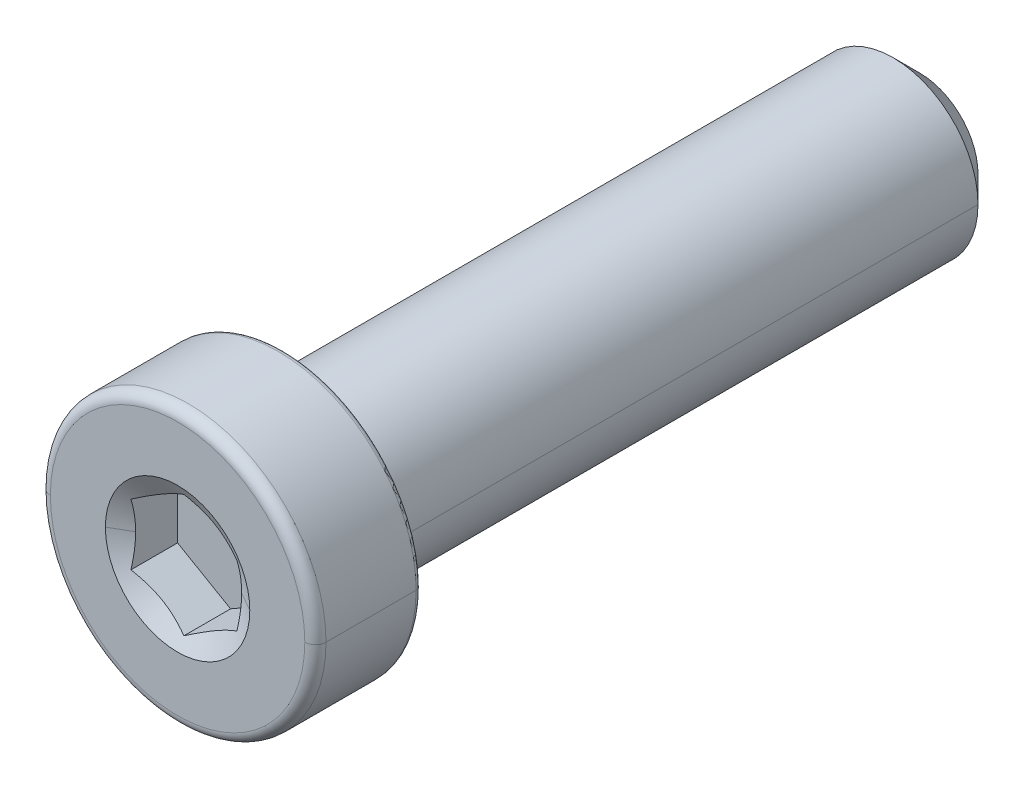
ISO-10303-21;
HEADER;
FILE_DESCRIPTION(('STEP AP214'),'2;1');
FILE_NAME('part.step','',(''),(''),'','','');
FILE_SCHEMA(('AUTOMOTIVE_DESIGN { 1 0 10303 214 1 1 1 1 }'));
ENDSEC;
DATA;
#1=APPLICATION_CONTEXT('core data for automotive mechanical design processes');
#2=APPLICATION_PROTOCOL_DEFINITION('international standard','automotive_design',2000,#1);
#3=PRODUCT_CONTEXT('',#1,'mechanical');
#4=PRODUCT('Part','Part','',(#3));
#5=PRODUCT_RELATED_PRODUCT_CATEGORY('part','',(#4));
#6=PRODUCT_DEFINITION_FORMATION('','',#4);
#7=PRODUCT_DEFINITION_CONTEXT('part definition',#1,'design');
#8=PRODUCT_DEFINITION('design','',#6,#7);
#9=PRODUCT_DEFINITION_SHAPE('','',#8);
#10=(LENGTH_UNIT() NAMED_UNIT(*) SI_UNIT(.MILLI.,.METRE.));
#11=(NAMED_UNIT(*) PLANE_ANGLE_UNIT() SI_UNIT($,.RADIAN.));
#12=(NAMED_UNIT(*) SI_UNIT($,.STERADIAN.) SOLID_ANGLE_UNIT());
#13=UNCERTAINTY_MEASURE_WITH_UNIT(LENGTH_MEASURE(1.E-05),#10,'distance_accuracy_value','');
#14=(GEOMETRIC_REPRESENTATION_CONTEXT(3) GLOBAL_UNCERTAINTY_ASSIGNED_CONTEXT((#13)) GLOBAL_UNIT_ASSIGNED_CONTEXT((#10,
#11,#12)) REPRESENTATION_CONTEXT('',''));
#15=CARTESIAN_POINT('',(0.,0.,0.));
#16=DIRECTION('',(0.,0.,1.));
#17=DIRECTION('',(1.,0.,0.));
#18=AXIS2_PLACEMENT_3D('',#15,#16,#17);
#19=CARTESIAN_POINT('',(0.,2.88675134594812,15.));
#20=DIRECTION('',(-0.5,0.866025403784439,0.));
#21=DIRECTION('',(0.,0.,1.));
#22=AXIS2_PLACEMENT_3D('',#19,#20,#21);
#23=PLANE('',#22);
#24=DIRECTION('',(0.,0.,1.));
#25=VECTOR('',#24,1.);
#26=CARTESIAN_POINT('',(0.,2.88675134594812,15.));
#27=LINE('',#26,#25);
#28=CARTESIAN_POINT('',(0.,2.88675134594812,15.));
#29=VERTEX_POINT('',#28);
#30=CARTESIAN_POINT('',(0.,2.88675134594812,17.2004275085882));
#31=VERTEX_POINT('',#30);
#32=EDGE_CURVE('E11',#29,#31,#27,.T.);
#33=ORIENTED_EDGE('',*,*,#32,.T.);
#34=CARTESIAN_POINT('',(0.,2.88675134594812,17.2004275085881));
#35=CARTESIAN_POINT('',(-0.668337161458471,2.50088670587065,16.9776484547663));
#36=CARTESIAN_POINT('',(-1.24761370688667,2.16644123643244,16.9771373916047));
#37=CARTESIAN_POINT('',(-1.55740642704751,1.98758232605459,16.9768640788869));
#38=CARTESIAN_POINT('',(-1.88103545904448,1.80073501731356,17.0371948002052));
#39=CARTESIAN_POINT('',(-2.17432824927882,1.63140234592039,17.0918702583466));
#40=CARTESIAN_POINT('',(-2.5,1.44337567297406,17.2004275085881));
#41=B_SPLINE_CURVE_WITH_KNOTS('',2,(#34,#35,#36,#37,#38,#39,#40),.UNSPECIFIED.,.F.,.F.,(3,2,2,
3),(0.,0.5,0.75,1.),.UNSPECIFIED.);
#42=CARTESIAN_POINT('',(-2.5,1.44337567297406,17.2004275085882));
#43=VERTEX_POINT('',#42);
#44=EDGE_CURVE('E180',#31,#43,#41,.T.);
#45=ORIENTED_EDGE('',*,*,#44,.T.);
#46=DIRECTION('',(0.,0.,1.));
#47=VECTOR('',#46,1.);
#48=CARTESIAN_POINT('',(-2.5,1.44337567297406,15.));
#49=LINE('',#48,#47);
#50=CARTESIAN_POINT('',(-2.5,1.44337567297406,15.));
#51=VERTEX_POINT('',#50);
#52=EDGE_CURVE('E174',#51,#43,#49,.T.);
#53=ORIENTED_EDGE('',*,*,#52,.F.);
#54=DIRECTION('',(-0.866025403784439,-0.5,0.));
#55=VECTOR('',#54,1.);
#56=CARTESIAN_POINT('',(0.,2.88675134594812,15.));
#57=LINE('',#56,#55);
#58=EDGE_CURVE('E386',#29,#51,#57,.T.);
#59=ORIENTED_EDGE('',*,*,#58,.F.);
#60=EDGE_LOOP('',(#33,#45,#53,#59));
#61=FACE_BOUND('',#60,.T.);
#62=ADVANCED_FACE('F16',(#61),#23,.F.);
#63=CARTESIAN_POINT('',(2.5,1.44337567297406,15.));
#64=DIRECTION('',(0.5,0.866025403784439,0.));
#65=DIRECTION('',(0.,0.,-1.));
#66=AXIS2_PLACEMENT_3D('',#63,#64,#65);
#67=PLANE('',#66);
#68=DIRECTION('',(0.,0.,1.));
#69=VECTOR('',#68,1.);
#70=CARTESIAN_POINT('',(2.5,1.44337567297406,15.));
#71=LINE('',#70,#69);
#72=CARTESIAN_POINT('',(2.5,1.44337567297406,15.));
#73=VERTEX_POINT('',#72);
#74=CARTESIAN_POINT('',(2.5,1.44337567297406,17.2004275085882));
#75=VERTEX_POINT('',#74);
#76=EDGE_CURVE('E28',#73,#75,#71,.T.);
#77=ORIENTED_EDGE('',*,*,#76,.T.);
#78=CARTESIAN_POINT('',(2.5,1.44337567297406,17.2004275085881));
#79=CARTESIAN_POINT('',(1.83166283856774,1.8292403130364,16.977648454775));
#80=CARTESIAN_POINT('',(1.25238629311333,2.16368578248975,16.9771373916047));
#81=CARTESIAN_POINT('',(0.942593572977376,2.34254469285323,16.9768640788823));
#82=CARTESIAN_POINT('',(0.618964540955522,2.52939200160862,17.0371948002052));
#83=CARTESIAN_POINT('',(0.3256717507212,2.69872467300178,17.0918702583466));
#84=CARTESIAN_POINT('',(0.,2.88675134594812,17.2004275085881));
#85=B_SPLINE_CURVE_WITH_KNOTS('',2,(#78,#79,#80,#81,#82,#83,#84),.UNSPECIFIED.,.F.,.F.,(3,2,2,
3),(0.,0.5,0.75,1.),.UNSPECIFIED.);
#86=EDGE_CURVE('E522',#75,#31,#85,.T.);
#87=ORIENTED_EDGE('',*,*,#86,.T.);
#88=ORIENTED_EDGE('',*,*,#32,.F.);
#89=DIRECTION('',(-0.866025403784439,0.5,0.));
#90=VECTOR('',#89,1.);
#91=CARTESIAN_POINT('',(2.5,1.44337567297406,15.));
#92=LINE('',#91,#90);
#93=EDGE_CURVE('E272',#73,#29,#92,.T.);
#94=ORIENTED_EDGE('',*,*,#93,.F.);
#95=EDGE_LOOP('',(#77,#87,#88,#94));
#96=FACE_BOUND('',#95,.T.);
#97=ADVANCED_FACE('F415',(#96),#67,.F.);
#98=CARTESIAN_POINT('',(2.5,-1.44337567297406,15.));
#99=DIRECTION('',(1.,0.,0.));
#100=DIRECTION('',(0.,1.,0.));
#101=AXIS2_PLACEMENT_3D('',#98,#99,#100);
#102=PLANE('',#101);
#103=DIRECTION('',(0.,0.,1.));
#104=VECTOR('',#103,1.);
#105=CARTESIAN_POINT('',(2.5,-1.44337567297406,15.));
#106=LINE('',#105,#104);
#107=CARTESIAN_POINT('',(2.5,-1.44337567297406,15.));
#108=VERTEX_POINT('',#107);
#109=CARTESIAN_POINT('',(2.5,-1.44337567297406,17.2004275085882));
#110=VERTEX_POINT('',#109);
#111=EDGE_CURVE('E52',#108,#110,#106,.T.);
#112=ORIENTED_EDGE('',*,*,#111,.T.);
#113=CARTESIAN_POINT('',(2.5,-1.44337567297406,17.2004275085881));
#114=CARTESIAN_POINT('',(2.5,-1.06712601981151,17.0918135893202));
#115=CARTESIAN_POINT('',(2.5,-0.72721411045275,17.0369619110228));
#116=CARTESIAN_POINT('',(2.5,-0.356480429060582,16.9771365148956));
#117=CARTESIAN_POINT('',(2.5,0.,16.9771365148956));
#118=B_SPLINE_CURVE_WITH_KNOTS('',2,(#113,#114,#115,#116,#117),.UNSPECIFIED.,.F.,.F.,(3,2,3),
(0.,0.5,1.),.UNSPECIFIED.);
#119=CARTESIAN_POINT('',(2.5,0.,16.9771365148956));
#120=VERTEX_POINT('',#119);
#121=EDGE_CURVE('E431',#110,#120,#118,.T.);
#122=ORIENTED_EDGE('',*,*,#121,.T.);
#123=CARTESIAN_POINT('',(2.5,0.,16.9771365148956));
#124=CARTESIAN_POINT('',(2.5,0.358406770652473,16.9771365148956));
#125=CARTESIAN_POINT('',(2.5,0.732414374404408,17.0378032632905));
#126=CARTESIAN_POINT('',(2.5,1.06935846545541,17.0924580408669));
#127=CARTESIAN_POINT('',(2.5,1.44337567297406,17.2004275085881));
#128=B_SPLINE_CURVE_WITH_KNOTS('',2,(#123,#124,#125,#126,#127),.UNSPECIFIED.,.F.,.F.,(3,2,3),
(0.,0.5,1.),.UNSPECIFIED.);
#129=EDGE_CURVE('E390',#120,#75,#128,.T.);
#130=ORIENTED_EDGE('',*,*,#129,.T.);
#131=ORIENTED_EDGE('',*,*,#76,.F.);
#132=DIRECTION('',(0.,1.,0.));
#133=VECTOR('',#132,1.);
#134=CARTESIAN_POINT('',(2.5,-1.44337567297406,15.));
#135=LINE('',#134,#133);
#136=EDGE_CURVE('E283',#108,#73,#135,.T.);
#137=ORIENTED_EDGE('',*,*,#136,.F.);
#138=EDGE_LOOP('',(#112,#122,#130,#131,#137));
#139=FACE_BOUND('',#138,.T.);
#140=ADVANCED_FACE('F406',(#139),#102,.F.);
#141=CARTESIAN_POINT('',(0.,-2.88675134594812,15.));
#142=DIRECTION('',(0.5,-0.866025403784439,0.));
#143=DIRECTION('',(0.,0.,-1.));
#144=AXIS2_PLACEMENT_3D('',#141,#142,#143);
#145=PLANE('',#144);
#146=DIRECTION('',(0.,0.,1.));
#147=VECTOR('',#146,1.);
#148=CARTESIAN_POINT('',(0.,-2.88675134594812,15.));
#149=LINE('',#148,#147);
#150=CARTESIAN_POINT('',(0.,-2.88675134594812,15.));
#151=VERTEX_POINT('',#150);
#152=CARTESIAN_POINT('',(0.,-2.88675134594812,17.2004275085882));
#153=VERTEX_POINT('',#152);
#154=EDGE_CURVE('E279',#151,#153,#149,.T.);
#155=ORIENTED_EDGE('',*,*,#154,.T.);
#156=CARTESIAN_POINT('',(0.,-2.88675134594812,17.2004275085881));
#157=CARTESIAN_POINT('',(0.668337161478003,-2.50088670585937,16.9776484547598));
#158=CARTESIAN_POINT('',(1.24761370688667,-2.16644123643244,16.9771373916047));
#159=CARTESIAN_POINT('',(1.55740642706888,-1.98758232604225,16.9768640788904));
#160=CARTESIAN_POINT('',(1.88103545904447,-1.80073501731356,17.0371948002052));
#161=CARTESIAN_POINT('',(2.17432824928195,-1.63140234591858,17.0918702583476));
#162=CARTESIAN_POINT('',(2.49999999999999,-1.44337567297406,17.2004275085881));
#163=B_SPLINE_CURVE_WITH_KNOTS('',2,(#156,#157,#158,#159,#160,#161,#162),.UNSPECIFIED.,.F.,.F.,
(3,2,2,3),(0.,0.5,0.75,1.),.UNSPECIFIED.);
#164=EDGE_CURVE('E475',#153,#110,#163,.T.);
#165=ORIENTED_EDGE('',*,*,#164,.T.);
#166=ORIENTED_EDGE('',*,*,#111,.F.);
#167=DIRECTION('',(0.866025403784438,0.5,0.));
#168=VECTOR('',#167,1.);
#169=CARTESIAN_POINT('',(0.,-2.88675134594812,15.));
#170=LINE('',#169,#168);
#171=EDGE_CURVE('E293',#151,#108,#170,.T.);
#172=ORIENTED_EDGE('',*,*,#171,.F.);
#173=EDGE_LOOP('',(#155,#165,#166,#172));
#174=FACE_BOUND('',#173,.T.);
#175=ADVANCED_FACE('F414',(#174),#145,.F.);
#176=CARTESIAN_POINT('',(-2.5,-1.44337567297406,15.));
#177=DIRECTION('',(-0.5,-0.866025403784439,0.));
#178=DIRECTION('',(-0.866025403784439,0.5,0.));
#179=AXIS2_PLACEMENT_3D('',#176,#177,#178);
#180=PLANE('',#179);
#181=DIRECTION('',(0.,0.,1.));
#182=VECTOR('',#181,1.);
#183=CARTESIAN_POINT('',(-2.5,-1.44337567297406,15.));
#184=LINE('',#183,#182);
#185=CARTESIAN_POINT('',(-2.5,-1.44337567297406,15.));
#186=VERTEX_POINT('',#185);
#187=CARTESIAN_POINT('',(-2.5,-1.44337567297406,17.2004275085882));
#188=VERTEX_POINT('',#187);
#189=EDGE_CURVE('E271',#186,#188,#184,.T.);
#190=ORIENTED_EDGE('',*,*,#189,.T.);
#191=CARTESIAN_POINT('',(-2.5,-1.44337567297406,17.2004275085882));
#192=CARTESIAN_POINT('',(-1.83166283852851,-1.82924031305906,16.9776484547619));
#193=CARTESIAN_POINT('',(-1.25238629311333,-2.16368578248975,16.9771373916047));
#194=CARTESIAN_POINT('',(-0.942593572940119,-2.34254469287474,16.9768640788892));
#195=CARTESIAN_POINT('',(-0.618964540955527,-2.52939200160862,17.0371948002052));
#196=CARTESIAN_POINT('',(-0.325671750721338,-2.69872467300171,17.0918702583465));
#197=CARTESIAN_POINT('',(0.,-2.88675134594812,17.2004275085882));
#198=B_SPLINE_CURVE_WITH_KNOTS('',2,(#191,#192,#193,#194,#195,#196,#197),.UNSPECIFIED.,.F.,.F.,
(3,2,2,3),(0.,0.5,0.75,1.),.UNSPECIFIED.);
#199=EDGE_CURVE('E198',#188,#153,#198,.T.);
#200=ORIENTED_EDGE('',*,*,#199,.T.);
#201=ORIENTED_EDGE('',*,*,#154,.F.);
#202=DIRECTION('',(0.866025403784439,-0.5,0.));
#203=VECTOR('',#202,1.);
#204=CARTESIAN_POINT('',(-2.5,-1.44337567297406,15.));
#205=LINE('',#204,#203);
#206=EDGE_CURVE('E394',#186,#151,#205,.T.);
#207=ORIENTED_EDGE('',*,*,#206,.F.);
#208=EDGE_LOOP('',(#190,#200,#201,#207));
#209=FACE_BOUND('',#208,.T.);
#210=ADVANCED_FACE('F216',(#209),#180,.F.);
#211=CARTESIAN_POINT('',(-2.5,1.44337567297406,15.));
#212=DIRECTION('',(-1.,0.,0.));
#213=DIRECTION('',(0.,1.,0.));
#214=AXIS2_PLACEMENT_3D('',#211,#212,#213);
#215=PLANE('',#214);
#216=ORIENTED_EDGE('',*,*,#52,.T.);
#217=CARTESIAN_POINT('',(-2.5,1.44337567297406,17.2004275085881));
#218=CARTESIAN_POINT('',(-2.5,1.06995270681446,17.0926295835712));
#219=CARTESIAN_POINT('',(-2.5,0.732414374404408,17.0378032632905));
#220=CARTESIAN_POINT('',(-2.5,0.358919436551062,16.9771365148956));
#221=CARTESIAN_POINT('',(-2.5,0.,16.9771365148956));
#222=B_SPLINE_CURVE_WITH_KNOTS('',2,(#217,#218,#219,#220,#221),.UNSPECIFIED.,.F.,.F.,(3,2,3),
(0.,0.5,1.),.UNSPECIFIED.);
#223=CARTESIAN_POINT('',(-2.5,0.,16.9771365148956));
#224=VERTEX_POINT('',#223);
#225=EDGE_CURVE('E166',#43,#224,#222,.T.);
#226=ORIENTED_EDGE('',*,*,#225,.T.);
#227=CARTESIAN_POINT('',(-2.5,0.,16.9771365148956));
#228=CARTESIAN_POINT('',(-2.5,-0.355967710710983,16.9771365148956));
#229=CARTESIAN_POINT('',(-2.5,-0.727214110452753,17.0369619110228));
#230=CARTESIAN_POINT('',(-2.5,-1.06653199864212,17.0916421101792));
#231=CARTESIAN_POINT('',(-2.5,-1.44337567297407,17.2004275085881));
#232=B_SPLINE_CURVE_WITH_KNOTS('',2,(#227,#228,#229,#230,#231),.UNSPECIFIED.,.F.,.F.,(3,2,3),
(0.,0.5,1.),.UNSPECIFIED.);
#233=EDGE_CURVE('E171',#224,#188,#232,.T.);
#234=ORIENTED_EDGE('',*,*,#233,.T.);
#235=ORIENTED_EDGE('',*,*,#189,.F.);
#236=DIRECTION('',(0.,-1.,0.));
#237=VECTOR('',#236,1.);
#238=CARTESIAN_POINT('',(-2.5,1.44337567297406,15.));
#239=LINE('',#238,#237);
#240=EDGE_CURVE('E389',#51,#186,#239,.T.);
#241=ORIENTED_EDGE('',*,*,#240,.F.);
#242=EDGE_LOOP('',(#216,#226,#234,#235,#241));
#243=FACE_BOUND('',#242,.T.);
#244=ADVANCED_FACE('F169',(#243),#215,.F.);
#245=CARTESIAN_POINT('',(0.,0.,15.));
#246=DIRECTION('',(0.,0.,1.));
#247=DIRECTION('',(1.,0.,0.));
#248=AXIS2_PLACEMENT_3D('',#245,#246,#247);
#249=PLANE('',#248);
#250=ORIENTED_EDGE('',*,*,#58,.T.);
#251=ORIENTED_EDGE('',*,*,#240,.T.);
#252=ORIENTED_EDGE('',*,*,#206,.T.);
#253=ORIENTED_EDGE('',*,*,#171,.T.);
#254=ORIENTED_EDGE('',*,*,#136,.T.);
#255=ORIENTED_EDGE('',*,*,#93,.T.);
#256=EDGE_LOOP('',(#250,#251,#252,#253,#254,#255));
#257=FACE_BOUND('',#256,.T.);
#258=ADVANCED_FACE('F215',(#257),#249,.T.);
#259=CARTESIAN_POINT('',(0.,0.,17.5));
#260=DIRECTION('',(0.,0.,1.));
#261=DIRECTION('',(1.,0.,0.));
#262=AXIS2_PLACEMENT_3D('',#259,#260,#261);
#263=CONICAL_SURFACE('',#262,3.40562612162344,1.0471975511966);
#264=DIRECTION('',(-0.86602540378444,0.,0.5));
#265=VECTOR('',#264,1.);
#266=CARTESIAN_POINT('',(-3.40562612162344,0.,17.5));
#267=LINE('',#266,#265);
#268=CARTESIAN_POINT('',(-3.40562612162344,0.,17.5));
#269=VERTEX_POINT('',#268);
#270=EDGE_CURVE('E185',#224,#269,#267,.T.);
#271=ORIENTED_EDGE('',*,*,#270,.F.);
#272=ORIENTED_EDGE('',*,*,#225,.F.);
#273=ORIENTED_EDGE('',*,*,#44,.F.);
#274=ORIENTED_EDGE('',*,*,#86,.F.);
#275=ORIENTED_EDGE('',*,*,#129,.F.);
#276=DIRECTION('',(0.86602540378444,0.,0.5));
#277=VECTOR('',#276,1.);
#278=CARTESIAN_POINT('',(3.40562612162344,0.,17.5));
#279=LINE('',#278,#277);
#280=CARTESIAN_POINT('',(3.40562612162344,0.,17.5));
#281=VERTEX_POINT('',#280);
#282=EDGE_CURVE('E903',#120,#281,#279,.T.);
#283=ORIENTED_EDGE('',*,*,#282,.T.);
#284=CARTESIAN_POINT('',(0.,0.,17.5));
#285=DIRECTION('',(0.,0.,1.));
#286=DIRECTION('',(1.,0.,0.));
#287=AXIS2_PLACEMENT_3D('',#284,#285,#286);
#288=CIRCLE('',#287,3.40562612162344);
#289=EDGE_CURVE('E181',#281,#269,#288,.T.);
#290=ORIENTED_EDGE('',*,*,#289,.T.);
#291=EDGE_LOOP('',(#271,#272,#273,#274,#275,#283,#290));
#292=FACE_BOUND('',#291,.T.);
#293=ADVANCED_FACE('F186',(#292),#263,.F.);
#294=CARTESIAN_POINT('',(0.,6.,17.5));
#295=DIRECTION('',(0.,0.,1.));
#296=DIRECTION('',(1.,0.,0.));
#297=AXIS2_PLACEMENT_3D('',#294,#295,#296);
#298=PLANE('',#297);
#299=ORIENTED_EDGE('',*,*,#289,.F.);
#300=CARTESIAN_POINT('',(0.,0.,17.5));
#301=DIRECTION('',(0.,0.,1.));
#302=DIRECTION('',(1.,0.,0.));
#303=AXIS2_PLACEMENT_3D('',#300,#301,#302);
#304=CIRCLE('',#303,3.40562612162344);
#305=EDGE_CURVE('E192',#269,#281,#304,.T.);
#306=ORIENTED_EDGE('',*,*,#305,.F.);
#307=EDGE_LOOP('',(#299,#306));
#308=FACE_BOUND('',#307,.T.);
#309=CARTESIAN_POINT('',(0.,0.,17.5));
#310=DIRECTION('',(0.,0.,-1.));
#311=DIRECTION('',(-1.,0.,0.));
#312=AXIS2_PLACEMENT_3D('',#309,#310,#311);
#313=CIRCLE('',#312,6.);
#314=CARTESIAN_POINT('',(-6.,0.,17.5));
#315=VERTEX_POINT('',#314);
#316=CARTESIAN_POINT('',(6.,0.,17.5));
#317=VERTEX_POINT('',#316);
#318=EDGE_CURVE('E304',#315,#317,#313,.T.);
#319=ORIENTED_EDGE('',*,*,#318,.F.);
#320=CARTESIAN_POINT('',(0.,0.,17.5));
#321=DIRECTION('',(0.,0.,-1.));
#322=DIRECTION('',(-1.,0.,0.));
#323=AXIS2_PLACEMENT_3D('',#320,#321,#322);
#324=CIRCLE('',#323,6.);
#325=EDGE_CURVE('E356',#317,#315,#324,.T.);
#326=ORIENTED_EDGE('',*,*,#325,.F.);
#327=EDGE_LOOP('',(#319,#326));
#328=FACE_BOUND('',#327,.T.);
#329=ADVANCED_FACE('F243',(#308,#328),#298,.T.);
#330=CARTESIAN_POINT('',(0.,0.,17.));
#331=DIRECTION('',(0.,0.,-1.));
#332=DIRECTION('',(-1.,0.,0.));
#333=AXIS2_PLACEMENT_3D('',#330,#331,#332);
#334=TOROIDAL_SURFACE('',#333,6.,0.5);
#335=CARTESIAN_POINT('',(6.,0.,17.));
#336=DIRECTION('',(0.,1.,0.));
#337=DIRECTION('',(-1.,0.,0.));
#338=AXIS2_PLACEMENT_3D('',#335,#336,#337);
#339=CIRCLE('',#338,0.5);
#340=CARTESIAN_POINT('',(6.5,0.,17.));
#341=VERTEX_POINT('',#340);
#342=EDGE_CURVE('E308',#317,#341,#339,.T.);
#343=ORIENTED_EDGE('',*,*,#342,.F.);
#344=ORIENTED_EDGE('',*,*,#325,.T.);
#345=CARTESIAN_POINT('',(-6.,0.,17.));
#346=DIRECTION('',(0.,-1.,0.));
#347=DIRECTION('',(0.,0.,-1.));
#348=AXIS2_PLACEMENT_3D('',#345,#346,#347);
#349=CIRCLE('',#348,0.5);
#350=CARTESIAN_POINT('',(-6.5,0.,17.));
#351=VERTEX_POINT('',#350);
#352=EDGE_CURVE('E321',#315,#351,#349,.T.);
#353=ORIENTED_EDGE('',*,*,#352,.T.);
#354=CARTESIAN_POINT('',(0.,0.,17.));
#355=DIRECTION('',(0.,0.,-1.));
#356=DIRECTION('',(-1.,0.,0.));
#357=AXIS2_PLACEMENT_3D('',#354,#355,#356);
#358=CIRCLE('',#357,6.5);
#359=EDGE_CURVE('E325',#341,#351,#358,.T.);
#360=ORIENTED_EDGE('',*,*,#359,.F.);
#361=EDGE_LOOP('',(#343,#344,#353,#360));
#362=FACE_BOUND('',#361,.T.);
#363=ADVANCED_FACE('F511',(#362),#334,.T.);
#364=CARTESIAN_POINT('',(0.,0.,-17.5));
#365=DIRECTION('',(0.,0.,-1.));
#366=DIRECTION('',(-1.,0.,0.));
#367=AXIS2_PLACEMENT_3D('',#364,#365,#366);
#368=CYLINDRICAL_SURFACE('',#367,6.5);
#369=DIRECTION('',(0.,0.,-1.));
#370=VECTOR('',#369,1.);
#371=CARTESIAN_POINT('',(6.5,0.,-17.5));
#372=LINE('',#371,#370);
#373=CARTESIAN_POINT('',(6.5,0.,12.75));
#374=VERTEX_POINT('',#373);
#375=EDGE_CURVE('E317',#341,#374,#372,.T.);
#376=ORIENTED_EDGE('',*,*,#375,.F.);
#377=ORIENTED_EDGE('',*,*,#359,.T.);
#378=DIRECTION('',(0.,0.,-1.));
#379=VECTOR('',#378,1.);
#380=CARTESIAN_POINT('',(-6.5,0.,-17.5));
#381=LINE('',#380,#379);
#382=CARTESIAN_POINT('',(-6.5,0.,12.75));
#383=VERTEX_POINT('',#382);
#384=EDGE_CURVE('E303',#351,#383,#381,.T.);
#385=ORIENTED_EDGE('',*,*,#384,.T.);
#386=CARTESIAN_POINT('',(0.,0.,12.75));
#387=DIRECTION('',(0.,0.,-1.));
#388=DIRECTION('',(-1.,0.,0.));
#389=AXIS2_PLACEMENT_3D('',#386,#387,#388);
#390=CIRCLE('',#389,6.5);
#391=EDGE_CURVE('E322',#374,#383,#390,.T.);
#392=ORIENTED_EDGE('',*,*,#391,.F.);
#393=EDGE_LOOP('',(#376,#377,#385,#392));
#394=FACE_BOUND('',#393,.T.);
#395=ADVANCED_FACE('F217',(#394),#368,.T.);
#396=CARTESIAN_POINT('',(0.,0.,12.75));
#397=DIRECTION('',(0.,0.,-1.));
#398=DIRECTION('',(-1.,0.,0.));
#399=AXIS2_PLACEMENT_3D('',#396,#397,#398);
#400=TOROIDAL_SURFACE('',#399,6.25,0.25);
#401=CARTESIAN_POINT('',(6.25,0.,12.75));
#402=DIRECTION('',(0.,1.,0.));
#403=DIRECTION('',(-1.,0.,0.));
#404=AXIS2_PLACEMENT_3D('',#401,#402,#403);
#405=CIRCLE('',#404,0.25);
#406=CARTESIAN_POINT('',(6.25,0.,12.5));
#407=VERTEX_POINT('',#406);
#408=EDGE_CURVE('E298',#374,#407,#405,.T.);
#409=ORIENTED_EDGE('',*,*,#408,.F.);
#410=ORIENTED_EDGE('',*,*,#391,.T.);
#411=CARTESIAN_POINT('',(-6.25,0.,12.75));
#412=DIRECTION('',(0.,-1.,0.));
#413=DIRECTION('',(0.,0.,-1.));
#414=AXIS2_PLACEMENT_3D('',#411,#412,#413);
#415=CIRCLE('',#414,0.25);
#416=CARTESIAN_POINT('',(-6.25,0.,12.5));
#417=VERTEX_POINT('',#416);
#418=EDGE_CURVE('E336',#383,#417,#415,.T.);
#419=ORIENTED_EDGE('',*,*,#418,.T.);
#420=CARTESIAN_POINT('',(0.,0.,12.5));
#421=DIRECTION('',(0.,0.,-1.));
#422=DIRECTION('',(-1.,0.,0.));
#423=AXIS2_PLACEMENT_3D('',#420,#421,#422);
#424=CIRCLE('',#423,6.25);
#425=EDGE_CURVE('E326',#407,#417,#424,.T.);
#426=ORIENTED_EDGE('',*,*,#425,.F.);
#427=EDGE_LOOP('',(#409,#410,#419,#426));
#428=FACE_BOUND('',#427,.T.);
#429=ADVANCED_FACE('F503',(#428),#400,.T.);
#430=CARTESIAN_POINT('',(0.,4.,12.5));
#431=DIRECTION('',(0.,0.,-1.));
#432=DIRECTION('',(0.,-1.,0.));
#433=AXIS2_PLACEMENT_3D('',#430,#431,#432);
#434=PLANE('',#433);
#435=CARTESIAN_POINT('',(0.,0.,12.5));
#436=DIRECTION('',(0.,0.,-1.));
#437=DIRECTION('',(-1.,0.,0.));
#438=AXIS2_PLACEMENT_3D('',#435,#436,#437);
#439=CIRCLE('',#438,4.);
#440=CARTESIAN_POINT('',(-4.,0.,12.5));
#441=VERTEX_POINT('',#440);
#442=CARTESIAN_POINT('',(4.,0.,12.5));
#443=VERTEX_POINT('',#442);
#444=EDGE_CURVE('E346',#441,#443,#439,.T.);
#445=ORIENTED_EDGE('',*,*,#444,.F.);
#446=CARTESIAN_POINT('',(0.,0.,12.5));
#447=DIRECTION('',(0.,0.,-1.));
#448=DIRECTION('',(-1.,0.,0.));
#449=AXIS2_PLACEMENT_3D('',#446,#447,#448);
#450=CIRCLE('',#449,4.);
#451=EDGE_CURVE('E364',#443,#441,#450,.T.);
#452=ORIENTED_EDGE('',*,*,#451,.F.);
#453=EDGE_LOOP('',(#445,#452));
#454=FACE_BOUND('',#453,.T.);
#455=CARTESIAN_POINT('',(0.,0.,12.5));
#456=DIRECTION('',(0.,0.,-1.));
#457=DIRECTION('',(-1.,0.,0.));
#458=AXIS2_PLACEMENT_3D('',#455,#456,#457);
#459=CIRCLE('',#458,6.25);
#460=EDGE_CURVE('E302',#417,#407,#459,.T.);
#461=ORIENTED_EDGE('',*,*,#460,.T.);
#462=ORIENTED_EDGE('',*,*,#425,.T.);
#463=EDGE_LOOP('',(#461,#462));
#464=FACE_BOUND('',#463,.T.);
#465=ADVANCED_FACE('F500',(#454,#464),#434,.T.);
#466=CARTESIAN_POINT('',(0.,0.,-17.5));
#467=DIRECTION('',(0.,0.,-1.));
#468=DIRECTION('',(-1.,0.,0.));
#469=AXIS2_PLACEMENT_3D('',#466,#467,#468);
#470=CYLINDRICAL_SURFACE('',#469,4.);
#471=DIRECTION('',(0.,0.,-1.));
#472=VECTOR('',#471,1.);
#473=CARTESIAN_POINT('',(4.,0.,-17.5));
#474=LINE('',#473,#472);
#475=CARTESIAN_POINT('',(4.,0.,-16.25));
#476=VERTEX_POINT('',#475);
#477=EDGE_CURVE('E350',#443,#476,#474,.T.);
#478=ORIENTED_EDGE('',*,*,#477,.F.);
#479=ORIENTED_EDGE('',*,*,#451,.T.);
#480=DIRECTION('',(0.,0.,-1.));
#481=VECTOR('',#480,1.);
#482=CARTESIAN_POINT('',(-4.,0.,-17.5));
#483=LINE('',#482,#481);
#484=CARTESIAN_POINT('',(-4.,0.,-16.25));
#485=VERTEX_POINT('',#484);
#486=EDGE_CURVE('E337',#441,#485,#483,.T.);
#487=ORIENTED_EDGE('',*,*,#486,.T.);
#488=CARTESIAN_POINT('',(0.,0.,-16.25));
#489=DIRECTION('',(0.,0.,-1.));
#490=DIRECTION('',(-1.,0.,0.));
#491=AXIS2_PLACEMENT_3D('',#488,#489,#490);
#492=CIRCLE('',#491,4.);
#493=EDGE_CURVE('E367',#476,#485,#492,.T.);
#494=ORIENTED_EDGE('',*,*,#493,.F.);
#495=EDGE_LOOP('',(#478,#479,#487,#494));
#496=FACE_BOUND('',#495,.T.);
#497=ADVANCED_FACE('F496',(#496),#470,.T.);
#498=CARTESIAN_POINT('',(0.,0.,-17.5));
#499=DIRECTION('',(0.,0.,1.));
#500=DIRECTION('',(1.,0.,0.));
#501=AXIS2_PLACEMENT_3D('',#498,#499,#500);
#502=CONICAL_SURFACE('',#501,2.75,0.785398163397449);
#503=DIRECTION('',(-0.707106781186549,0.,0.707106781186547));
#504=VECTOR('',#503,1.);
#505=CARTESIAN_POINT('',(-2.75,0.,-17.5));
#506=LINE('',#505,#504);
#507=CARTESIAN_POINT('',(-2.75,0.,-17.5));
#508=VERTEX_POINT('',#507);
#509=EDGE_CURVE('E363',#508,#485,#506,.T.);
#510=ORIENTED_EDGE('',*,*,#509,.F.);
#511=CARTESIAN_POINT('',(0.,0.,-17.5));
#512=DIRECTION('',(0.,0.,-1.));
#513=DIRECTION('',(-1.,0.,0.));
#514=AXIS2_PLACEMENT_3D('',#511,#512,#513);
#515=CIRCLE('',#514,2.75);
#516=CARTESIAN_POINT('',(2.75,0.,-17.5));
#517=VERTEX_POINT('',#516);
#518=EDGE_CURVE('E375',#517,#508,#515,.T.);
#519=ORIENTED_EDGE('',*,*,#518,.F.);
#520=DIRECTION('',(0.707106781186549,0.,0.707106781186547));
#521=VECTOR('',#520,1.);
#522=CARTESIAN_POINT('',(2.75,0.,-17.5));
#523=LINE('',#522,#521);
#524=EDGE_CURVE('E371',#517,#476,#523,.T.);
#525=ORIENTED_EDGE('',*,*,#524,.T.);
#526=ORIENTED_EDGE('',*,*,#493,.T.);
#527=EDGE_LOOP('',(#510,#519,#525,#526));
#528=FACE_BOUND('',#527,.T.);
#529=ADVANCED_FACE('F492',(#528),#502,.T.);
#530=CARTESIAN_POINT('',(0.,0.,-17.5));
#531=DIRECTION('',(0.,0.,-1.));
#532=DIRECTION('',(0.,-1.,0.));
#533=AXIS2_PLACEMENT_3D('',#530,#531,#532);
#534=PLANE('',#533);
#535=ORIENTED_EDGE('',*,*,#518,.T.);
#536=CARTESIAN_POINT('',(0.,0.,-17.5));
#537=DIRECTION('',(0.,0.,-1.));
#538=DIRECTION('',(-1.,0.,0.));
#539=AXIS2_PLACEMENT_3D('',#536,#537,#538);
#540=CIRCLE('',#539,2.75);
#541=EDGE_CURVE('E341',#508,#517,#540,.T.);
#542=ORIENTED_EDGE('',*,*,#541,.T.);
#543=EDGE_LOOP('',(#535,#542));
#544=FACE_BOUND('',#543,.T.);
#545=ADVANCED_FACE('F489',(#544),#534,.T.);
#546=CARTESIAN_POINT('',(0.,0.,-17.5));
#547=DIRECTION('',(0.,0.,1.));
#548=DIRECTION('',(1.,0.,0.));
#549=AXIS2_PLACEMENT_3D('',#546,#547,#548);
#550=CONICAL_SURFACE('',#549,2.75,0.785398163397449);
#551=ORIENTED_EDGE('',*,*,#541,.F.);
#552=ORIENTED_EDGE('',*,*,#509,.T.);
#553=CARTESIAN_POINT('',(0.,0.,-16.25));
#554=DIRECTION('',(0.,0.,-1.));
#555=DIRECTION('',(-1.,0.,0.));
#556=AXIS2_PLACEMENT_3D('',#553,#554,#555);
#557=CIRCLE('',#556,4.);
#558=EDGE_CURVE('E342',#485,#476,#557,.T.);
#559=ORIENTED_EDGE('',*,*,#558,.T.);
#560=ORIENTED_EDGE('',*,*,#524,.F.);
#561=EDGE_LOOP('',(#551,#552,#559,#560));
#562=FACE_BOUND('',#561,.T.);
#563=ADVANCED_FACE('F488',(#562),#550,.T.);
#564=CARTESIAN_POINT('',(0.,0.,-17.5));
#565=DIRECTION('',(0.,0.,-1.));
#566=DIRECTION('',(-1.,0.,0.));
#567=AXIS2_PLACEMENT_3D('',#564,#565,#566);
#568=CYLINDRICAL_SURFACE('',#567,4.);
#569=ORIENTED_EDGE('',*,*,#444,.T.);
#570=ORIENTED_EDGE('',*,*,#477,.T.);
#571=ORIENTED_EDGE('',*,*,#558,.F.);
#572=ORIENTED_EDGE('',*,*,#486,.F.);
#573=EDGE_LOOP('',(#569,#570,#571,#572));
#574=FACE_BOUND('',#573,.T.);
#575=ADVANCED_FACE('F610',(#574),#568,.T.);
#576=CARTESIAN_POINT('',(0.,0.,12.75));
#577=DIRECTION('',(0.,0.,-1.));
#578=DIRECTION('',(-1.,0.,0.));
#579=AXIS2_PLACEMENT_3D('',#576,#577,#578);
#580=TOROIDAL_SURFACE('',#579,6.25,0.25);
#581=CARTESIAN_POINT('',(0.,0.,12.75));
#582=DIRECTION('',(0.,0.,-1.));
#583=DIRECTION('',(-1.,0.,0.));
#584=AXIS2_PLACEMENT_3D('',#581,#582,#583);
#585=CIRCLE('',#584,6.5);
#586=EDGE_CURVE('E313',#383,#374,#585,.T.);
#587=ORIENTED_EDGE('',*,*,#586,.T.);
#588=ORIENTED_EDGE('',*,*,#408,.T.);
#589=ORIENTED_EDGE('',*,*,#460,.F.);
#590=ORIENTED_EDGE('',*,*,#418,.F.);
#591=EDGE_LOOP('',(#587,#588,#589,#590));
#592=FACE_BOUND('',#591,.T.);
#593=ADVANCED_FACE('F244',(#592),#580,.T.);
#594=CARTESIAN_POINT('',(0.,0.,-17.5));
#595=DIRECTION('',(0.,0.,-1.));
#596=DIRECTION('',(-1.,0.,0.));
#597=AXIS2_PLACEMENT_3D('',#594,#595,#596);
#598=CYLINDRICAL_SURFACE('',#597,6.5);
#599=CARTESIAN_POINT('',(0.,0.,17.));
#600=DIRECTION('',(0.,0.,-1.));
#601=DIRECTION('',(-1.,0.,0.));
#602=AXIS2_PLACEMENT_3D('',#599,#600,#601);
#603=CIRCLE('',#602,6.5);
#604=EDGE_CURVE('E312',#351,#341,#603,.T.);
#605=ORIENTED_EDGE('',*,*,#604,.T.);
#606=ORIENTED_EDGE('',*,*,#375,.T.);
#607=ORIENTED_EDGE('',*,*,#586,.F.);
#608=ORIENTED_EDGE('',*,*,#384,.F.);
#609=EDGE_LOOP('',(#605,#606,#607,#608));
#610=FACE_BOUND('',#609,.T.);
#611=ADVANCED_FACE('F587',(#610),#598,.T.);
#612=CARTESIAN_POINT('',(0.,0.,17.));
#613=DIRECTION('',(0.,0.,-1.));
#614=DIRECTION('',(-1.,0.,0.));
#615=AXIS2_PLACEMENT_3D('',#612,#613,#614);
#616=TOROIDAL_SURFACE('',#615,6.,0.5);
#617=ORIENTED_EDGE('',*,*,#318,.T.);
#618=ORIENTED_EDGE('',*,*,#342,.T.);
#619=ORIENTED_EDGE('',*,*,#604,.F.);
#620=ORIENTED_EDGE('',*,*,#352,.F.);
#621=EDGE_LOOP('',(#617,#618,#619,#620));
#622=FACE_BOUND('',#621,.T.);
#623=ADVANCED_FACE('F442',(#622),#616,.T.);
#624=CARTESIAN_POINT('',(0.,0.,17.5));
#625=DIRECTION('',(0.,0.,1.));
#626=DIRECTION('',(1.,0.,0.));
#627=AXIS2_PLACEMENT_3D('',#624,#625,#626);
#628=CONICAL_SURFACE('',#627,3.40562612162344,1.0471975511966);
#629=ORIENTED_EDGE('',*,*,#233,.F.);
#630=ORIENTED_EDGE('',*,*,#270,.T.);
#631=ORIENTED_EDGE('',*,*,#305,.T.);
#632=ORIENTED_EDGE('',*,*,#282,.F.);
#633=ORIENTED_EDGE('',*,*,#121,.F.);
#634=ORIENTED_EDGE('',*,*,#164,.F.);
#635=ORIENTED_EDGE('',*,*,#199,.F.);
#636=EDGE_LOOP('',(#629,#630,#631,#632,#633,#634,#635));
#637=FACE_BOUND('',#636,.T.);
#638=ADVANCED_FACE('F195',(#637),#628,.F.);
#639=CLOSED_SHELL('',(#62,#97,#140,#175,#210,#244,#258,#293,#329,#363,#395,#429,#465,#497,#529,
#545,#563,#575,#593,#611,#623,#638));
#640=MANIFOLD_SOLID_BREP('B1',#639);
#641=ADVANCED_BREP_SHAPE_REPRESENTATION('',(#18,#640),#14);
#642=SHAPE_DEFINITION_REPRESENTATION(#9,#641);
ENDSEC;
END-ISO-10303-21;
